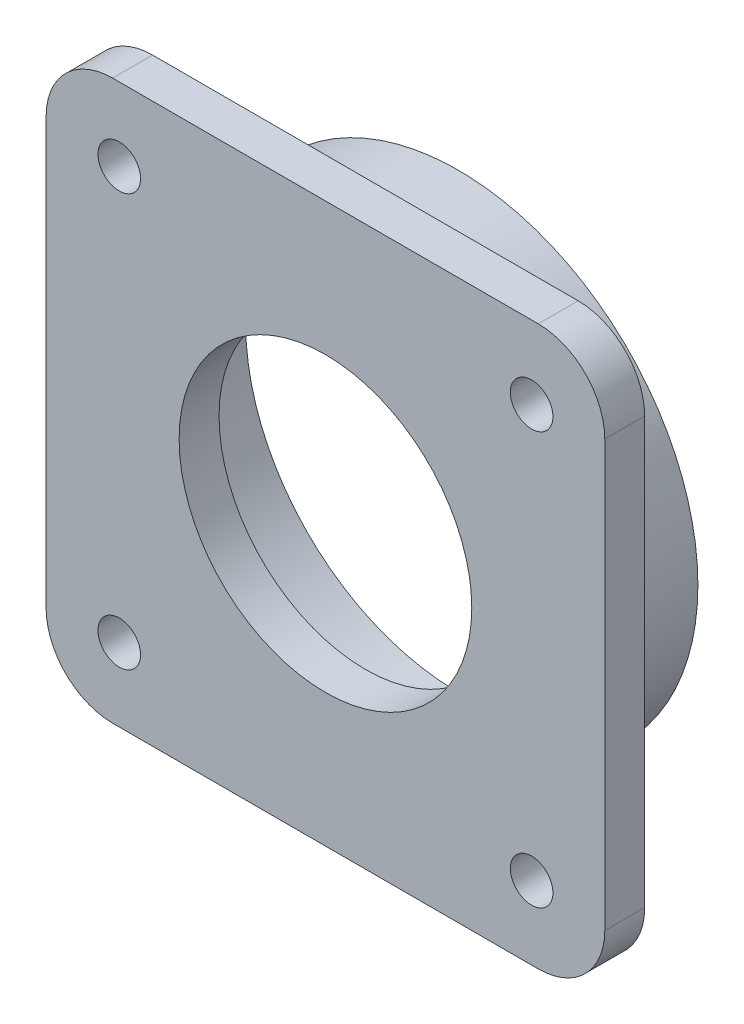
ISO-10303-21;
HEADER;
FILE_DESCRIPTION(('STEP AP214'),'2;1');
FILE_NAME('part.step','',(''),(''),'','','');
FILE_SCHEMA(('AUTOMOTIVE_DESIGN { 1 0 10303 214 1 1 1 1 }'));
ENDSEC;
DATA;
#1=APPLICATION_CONTEXT('core data for automotive mechanical design processes');
#2=APPLICATION_PROTOCOL_DEFINITION('international standard','automotive_design',2000,#1);
#3=PRODUCT_CONTEXT('',#1,'mechanical');
#4=PRODUCT('Part','Part','',(#3));
#5=PRODUCT_RELATED_PRODUCT_CATEGORY('part','',(#4));
#6=PRODUCT_DEFINITION_FORMATION('','',#4);
#7=PRODUCT_DEFINITION_CONTEXT('part definition',#1,'design');
#8=PRODUCT_DEFINITION('design','',#6,#7);
#9=PRODUCT_DEFINITION_SHAPE('','',#8);
#10=(LENGTH_UNIT() NAMED_UNIT(*) SI_UNIT(.MILLI.,.METRE.));
#11=(NAMED_UNIT(*) PLANE_ANGLE_UNIT() SI_UNIT($,.RADIAN.));
#12=(NAMED_UNIT(*) SI_UNIT($,.STERADIAN.) SOLID_ANGLE_UNIT());
#13=UNCERTAINTY_MEASURE_WITH_UNIT(LENGTH_MEASURE(1.E-05),#10,'distance_accuracy_value','');
#14=(GEOMETRIC_REPRESENTATION_CONTEXT(3) GLOBAL_UNCERTAINTY_ASSIGNED_CONTEXT((#13)) GLOBAL_UNIT_ASSIGNED_CONTEXT((#10,
#11,#12)) REPRESENTATION_CONTEXT('',''));
#15=CARTESIAN_POINT('',(0.,0.,0.));
#16=DIRECTION('',(0.,0.,1.));
#17=DIRECTION('',(1.,0.,0.));
#18=AXIS2_PLACEMENT_3D('',#15,#16,#17);
#19=CARTESIAN_POINT('',(0.,0.,0.));
#20=DIRECTION('',(0.,0.,1.));
#21=DIRECTION('',(1.,0.,0.));
#22=AXIS2_PLACEMENT_3D('',#19,#20,#21);
#23=PLANE('',#22);
#24=CARTESIAN_POINT('',(0.,0.,0.));
#25=DIRECTION('',(0.,0.,1.));
#26=DIRECTION('',(1.,0.,0.));
#27=AXIS2_PLACEMENT_3D('',#24,#25,#26);
#28=CIRCLE('',#27,11.);
#29=CARTESIAN_POINT('',(11.,0.,0.));
#30=VERTEX_POINT('',#29);
#31=EDGE_CURVE('E153',#30,#30,#28,.T.);
#32=ORIENTED_EDGE('',*,*,#31,.T.);
#33=EDGE_LOOP('',(#32));
#34=FACE_BOUND('',#33,.T.);
#35=CARTESIAN_POINT('',(0.,0.,0.));
#36=DIRECTION('',(0.,0.,-1.));
#37=DIRECTION('',(-1.,0.,0.));
#38=AXIS2_PLACEMENT_3D('',#35,#36,#37);
#39=CIRCLE('',#38,16.);
#40=CARTESIAN_POINT('',(-16.,0.,0.));
#41=VERTEX_POINT('',#40);
#42=EDGE_CURVE('E333',#41,#41,#39,.T.);
#43=ORIENTED_EDGE('',*,*,#42,.T.);
#44=EDGE_LOOP('',(#43));
#45=FACE_BOUND('',#44,.T.);
#46=ADVANCED_FACE('F47',(#34,#45),#23,.F.);
#47=CARTESIAN_POINT('',(0.,-21.,3.));
#48=DIRECTION('',(0.,1.,0.));
#49=DIRECTION('',(0.,0.,1.));
#50=AXIS2_PLACEMENT_3D('',#47,#48,#49);
#51=PLANE('',#50);
#52=DIRECTION('',(1.,0.,0.));
#53=VECTOR('',#52,1.);
#54=CARTESIAN_POINT('',(0.,-21.,3.));
#55=LINE('',#54,#53);
#56=CARTESIAN_POINT('',(-16.,-21.,3.));
#57=VERTEX_POINT('',#56);
#58=CARTESIAN_POINT('',(16.,-21.,3.));
#59=VERTEX_POINT('',#58);
#60=EDGE_CURVE('E136',#57,#59,#55,.T.);
#61=ORIENTED_EDGE('',*,*,#60,.F.);
#62=DIRECTION('',(0.,0.,-1.));
#63=VECTOR('',#62,1.);
#64=CARTESIAN_POINT('',(-16.,-21.,0.));
#65=LINE('',#64,#63);
#66=CARTESIAN_POINT('',(-16.,-21.,0.));
#67=VERTEX_POINT('',#66);
#68=EDGE_CURVE('E119',#57,#67,#65,.T.);
#69=ORIENTED_EDGE('',*,*,#68,.T.);
#70=DIRECTION('',(1.,0.,0.));
#71=VECTOR('',#70,1.);
#72=CARTESIAN_POINT('',(0.,-21.,0.));
#73=LINE('',#72,#71);
#74=CARTESIAN_POINT('',(16.,-21.,0.));
#75=VERTEX_POINT('',#74);
#76=EDGE_CURVE('E133',#67,#75,#73,.T.);
#77=ORIENTED_EDGE('',*,*,#76,.T.);
#78=DIRECTION('',(0.,0.,-1.));
#79=VECTOR('',#78,1.);
#80=CARTESIAN_POINT('',(16.,-21.,3.));
#81=LINE('',#80,#79);
#82=EDGE_CURVE('E139',#75,#59,#81,.F.);
#83=ORIENTED_EDGE('',*,*,#82,.T.);
#84=EDGE_LOOP('',(#61,#69,#77,#83));
#85=FACE_BOUND('',#84,.T.);
#86=ADVANCED_FACE('F132',(#85),#51,.F.);
#87=CARTESIAN_POINT('',(21.,0.,3.));
#88=DIRECTION('',(-1.,0.,0.));
#89=DIRECTION('',(0.,0.,1.));
#90=AXIS2_PLACEMENT_3D('',#87,#88,#89);
#91=PLANE('',#90);
#92=DIRECTION('',(0.,1.,0.));
#93=VECTOR('',#92,1.);
#94=CARTESIAN_POINT('',(21.,0.,3.));
#95=LINE('',#94,#93);
#96=CARTESIAN_POINT('',(21.,-16.,3.));
#97=VERTEX_POINT('',#96);
#98=CARTESIAN_POINT('',(21.,16.,3.));
#99=VERTEX_POINT('',#98);
#100=EDGE_CURVE('E214',#97,#99,#95,.T.);
#101=ORIENTED_EDGE('',*,*,#100,.F.);
#102=DIRECTION('',(0.,0.,-1.));
#103=VECTOR('',#102,1.);
#104=CARTESIAN_POINT('',(21.,-16.,3.));
#105=LINE('',#104,#103);
#106=CARTESIAN_POINT('',(21.,-16.,0.));
#107=VERTEX_POINT('',#106);
#108=EDGE_CURVE('E193',#97,#107,#105,.T.);
#109=ORIENTED_EDGE('',*,*,#108,.T.);
#110=DIRECTION('',(0.,1.,0.));
#111=VECTOR('',#110,1.);
#112=CARTESIAN_POINT('',(21.,0.,0.));
#113=LINE('',#112,#111);
#114=CARTESIAN_POINT('',(21.,16.,0.));
#115=VERTEX_POINT('',#114);
#116=EDGE_CURVE('E144',#107,#115,#113,.T.);
#117=ORIENTED_EDGE('',*,*,#116,.T.);
#118=DIRECTION('',(0.,0.,-1.));
#119=VECTOR('',#118,1.);
#120=CARTESIAN_POINT('',(21.,16.,3.));
#121=LINE('',#120,#119);
#122=EDGE_CURVE('E190',#115,#99,#121,.F.);
#123=ORIENTED_EDGE('',*,*,#122,.T.);
#124=EDGE_LOOP('',(#101,#109,#117,#123));
#125=FACE_BOUND('',#124,.T.);
#126=ADVANCED_FACE('F259',(#125),#91,.F.);
#127=CARTESIAN_POINT('',(0.,21.,3.));
#128=DIRECTION('',(0.,1.,0.));
#129=DIRECTION('',(0.,0.,1.));
#130=AXIS2_PLACEMENT_3D('',#127,#128,#129);
#131=PLANE('',#130);
#132=DIRECTION('',(1.,0.,0.));
#133=VECTOR('',#132,1.);
#134=CARTESIAN_POINT('',(0.,21.,3.));
#135=LINE('',#134,#133);
#136=CARTESIAN_POINT('',(-16.,21.,3.));
#137=VERTEX_POINT('',#136);
#138=CARTESIAN_POINT('',(16.,21.,3.));
#139=VERTEX_POINT('',#138);
#140=EDGE_CURVE('E202',#137,#139,#135,.T.);
#141=ORIENTED_EDGE('',*,*,#140,.T.);
#142=DIRECTION('',(0.,0.,-1.));
#143=VECTOR('',#142,1.);
#144=CARTESIAN_POINT('',(16.,21.,0.));
#145=LINE('',#144,#143);
#146=CARTESIAN_POINT('',(16.,21.,0.));
#147=VERTEX_POINT('',#146);
#148=EDGE_CURVE('E56',#139,#147,#145,.T.);
#149=ORIENTED_EDGE('',*,*,#148,.T.);
#150=DIRECTION('',(1.,0.,0.));
#151=VECTOR('',#150,1.);
#152=CARTESIAN_POINT('',(0.,21.,0.));
#153=LINE('',#152,#151);
#154=CARTESIAN_POINT('',(-16.,21.,0.));
#155=VERTEX_POINT('',#154);
#156=EDGE_CURVE('E150',#155,#147,#153,.T.);
#157=ORIENTED_EDGE('',*,*,#156,.F.);
#158=DIRECTION('',(0.,0.,-1.));
#159=VECTOR('',#158,1.);
#160=CARTESIAN_POINT('',(-16.,21.,3.));
#161=LINE('',#160,#159);
#162=EDGE_CURVE('E70',#155,#137,#161,.F.);
#163=ORIENTED_EDGE('',*,*,#162,.T.);
#164=EDGE_LOOP('',(#141,#149,#157,#163));
#165=FACE_BOUND('',#164,.T.);
#166=ADVANCED_FACE('F201',(#165),#131,.T.);
#167=CARTESIAN_POINT('',(-15.5,15.5,3.));
#168=DIRECTION('',(0.,0.,-1.));
#169=DIRECTION('',(-1.,0.,0.));
#170=AXIS2_PLACEMENT_3D('',#167,#168,#169);
#171=CYLINDRICAL_SURFACE('',#170,1.6);
#172=CARTESIAN_POINT('',(-15.5,15.5,3.));
#173=DIRECTION('',(0.,0.,1.));
#174=DIRECTION('',(1.,0.,0.));
#175=AXIS2_PLACEMENT_3D('',#172,#173,#174);
#176=CIRCLE('',#175,1.6);
#177=CARTESIAN_POINT('',(-13.9,15.5,3.));
#178=VERTEX_POINT('',#177);
#179=EDGE_CURVE('E310',#178,#178,#176,.T.);
#180=ORIENTED_EDGE('',*,*,#179,.T.);
#181=EDGE_LOOP('',(#180));
#182=FACE_BOUND('',#181,.T.);
#183=CARTESIAN_POINT('',(-15.5,15.5,0.));
#184=DIRECTION('',(0.,0.,1.));
#185=DIRECTION('',(1.,0.,0.));
#186=AXIS2_PLACEMENT_3D('',#183,#184,#185);
#187=CIRCLE('',#186,1.6);
#188=CARTESIAN_POINT('',(-13.9,15.5,0.));
#189=VERTEX_POINT('',#188);
#190=EDGE_CURVE('E145',#189,#189,#187,.T.);
#191=ORIENTED_EDGE('',*,*,#190,.F.);
#192=EDGE_LOOP('',(#191));
#193=FACE_BOUND('',#192,.T.);
#194=ADVANCED_FACE('F239',(#182,#193),#171,.F.);
#195=CARTESIAN_POINT('',(0.,0.,3.));
#196=DIRECTION('',(0.,0.,-1.));
#197=DIRECTION('',(-1.,0.,0.));
#198=AXIS2_PLACEMENT_3D('',#195,#196,#197);
#199=CYLINDRICAL_SURFACE('',#198,11.);
#200=CARTESIAN_POINT('',(0.,0.,3.));
#201=DIRECTION('',(0.,0.,1.));
#202=DIRECTION('',(1.,0.,0.));
#203=AXIS2_PLACEMENT_3D('',#200,#201,#202);
#204=CIRCLE('',#203,11.);
#205=CARTESIAN_POINT('',(11.,0.,3.));
#206=VERTEX_POINT('',#205);
#207=EDGE_CURVE('E316',#206,#206,#204,.T.);
#208=ORIENTED_EDGE('',*,*,#207,.T.);
#209=EDGE_LOOP('',(#208));
#210=FACE_BOUND('',#209,.T.);
#211=ORIENTED_EDGE('',*,*,#31,.F.);
#212=EDGE_LOOP('',(#211));
#213=FACE_BOUND('',#212,.T.);
#214=ADVANCED_FACE('F236',(#210,#213),#199,.F.);
#215=CARTESIAN_POINT('',(-15.5000000000002,-15.4999999999998,3.));
#216=DIRECTION('',(0.,0.,-1.));
#217=DIRECTION('',(-1.,0.,0.));
#218=AXIS2_PLACEMENT_3D('',#215,#216,#217);
#219=CYLINDRICAL_SURFACE('',#218,1.6);
#220=CARTESIAN_POINT('',(-15.5000000000002,-15.4999999999998,3.));
#221=DIRECTION('',(0.,0.,1.));
#222=DIRECTION('',(1.,0.,0.));
#223=AXIS2_PLACEMENT_3D('',#220,#221,#222);
#224=CIRCLE('',#223,1.6);
#225=CARTESIAN_POINT('',(-13.9000000000002,-15.4999999999998,3.));
#226=VERTEX_POINT('',#225);
#227=EDGE_CURVE('E319',#226,#226,#224,.T.);
#228=ORIENTED_EDGE('',*,*,#227,.T.);
#229=EDGE_LOOP('',(#228));
#230=FACE_BOUND('',#229,.T.);
#231=CARTESIAN_POINT('',(-15.5000000000002,-15.4999999999998,0.));
#232=DIRECTION('',(0.,0.,1.));
#233=DIRECTION('',(1.,0.,0.));
#234=AXIS2_PLACEMENT_3D('',#231,#232,#233);
#235=CIRCLE('',#234,1.6);
#236=CARTESIAN_POINT('',(-13.9000000000002,-15.4999999999998,0.));
#237=VERTEX_POINT('',#236);
#238=EDGE_CURVE('E227',#237,#237,#235,.T.);
#239=ORIENTED_EDGE('',*,*,#238,.F.);
#240=EDGE_LOOP('',(#239));
#241=FACE_BOUND('',#240,.T.);
#242=ADVANCED_FACE('F238',(#230,#241),#219,.F.);
#243=CARTESIAN_POINT('',(15.5000000000001,15.4999999999999,3.));
#244=DIRECTION('',(0.,0.,-1.));
#245=DIRECTION('',(-1.,0.,0.));
#246=AXIS2_PLACEMENT_3D('',#243,#244,#245);
#247=CYLINDRICAL_SURFACE('',#246,1.6);
#248=CARTESIAN_POINT('',(15.5000000000001,15.4999999999999,3.));
#249=DIRECTION('',(0.,0.,1.));
#250=DIRECTION('',(1.,0.,0.));
#251=AXIS2_PLACEMENT_3D('',#248,#249,#250);
#252=CIRCLE('',#251,1.6);
#253=CARTESIAN_POINT('',(17.1000000000001,15.4999999999999,3.));
#254=VERTEX_POINT('',#253);
#255=EDGE_CURVE('E323',#254,#254,#252,.T.);
#256=ORIENTED_EDGE('',*,*,#255,.T.);
#257=EDGE_LOOP('',(#256));
#258=FACE_BOUND('',#257,.T.);
#259=CARTESIAN_POINT('',(15.5000000000001,15.4999999999999,0.));
#260=DIRECTION('',(0.,0.,1.));
#261=DIRECTION('',(1.,0.,0.));
#262=AXIS2_PLACEMENT_3D('',#259,#260,#261);
#263=CIRCLE('',#262,1.6);
#264=CARTESIAN_POINT('',(17.1000000000001,15.4999999999999,0.));
#265=VERTEX_POINT('',#264);
#266=EDGE_CURVE('E222',#265,#265,#263,.T.);
#267=ORIENTED_EDGE('',*,*,#266,.F.);
#268=EDGE_LOOP('',(#267));
#269=FACE_BOUND('',#268,.T.);
#270=ADVANCED_FACE('F246',(#258,#269),#247,.F.);
#271=CARTESIAN_POINT('',(15.4999999999999,-15.5000000000001,3.));
#272=DIRECTION('',(0.,0.,-1.));
#273=DIRECTION('',(-1.,0.,0.));
#274=AXIS2_PLACEMENT_3D('',#271,#272,#273);
#275=CYLINDRICAL_SURFACE('',#274,1.6);
#276=CARTESIAN_POINT('',(15.4999999999999,-15.5000000000001,3.));
#277=DIRECTION('',(0.,0.,1.));
#278=DIRECTION('',(1.,0.,0.));
#279=AXIS2_PLACEMENT_3D('',#276,#277,#278);
#280=CIRCLE('',#279,1.6);
#281=CARTESIAN_POINT('',(17.0999999999999,-15.5000000000001,3.));
#282=VERTEX_POINT('',#281);
#283=EDGE_CURVE('E163',#282,#282,#280,.T.);
#284=ORIENTED_EDGE('',*,*,#283,.T.);
#285=EDGE_LOOP('',(#284));
#286=FACE_BOUND('',#285,.T.);
#287=CARTESIAN_POINT('',(15.4999999999999,-15.5000000000001,0.));
#288=DIRECTION('',(0.,0.,1.));
#289=DIRECTION('',(1.,0.,0.));
#290=AXIS2_PLACEMENT_3D('',#287,#288,#289);
#291=CIRCLE('',#290,1.6);
#292=CARTESIAN_POINT('',(17.0999999999999,-15.5000000000001,0.));
#293=VERTEX_POINT('',#292);
#294=EDGE_CURVE('E218',#293,#293,#291,.T.);
#295=ORIENTED_EDGE('',*,*,#294,.F.);
#296=EDGE_LOOP('',(#295));
#297=FACE_BOUND('',#296,.T.);
#298=ADVANCED_FACE('F286',(#286,#297),#275,.F.);
#299=CARTESIAN_POINT('',(-21.,0.,3.));
#300=DIRECTION('',(-1.,0.,0.));
#301=DIRECTION('',(0.,0.,1.));
#302=AXIS2_PLACEMENT_3D('',#299,#300,#301);
#303=PLANE('',#302);
#304=DIRECTION('',(0.,1.,0.));
#305=VECTOR('',#304,1.);
#306=CARTESIAN_POINT('',(-21.,0.,0.));
#307=LINE('',#306,#305);
#308=CARTESIAN_POINT('',(-21.,-16.,0.));
#309=VERTEX_POINT('',#308);
#310=CARTESIAN_POINT('',(-21.,16.,0.));
#311=VERTEX_POINT('',#310);
#312=EDGE_CURVE('E160',#309,#311,#307,.T.);
#313=ORIENTED_EDGE('',*,*,#312,.F.);
#314=DIRECTION('',(0.,0.,-1.));
#315=VECTOR('',#314,1.);
#316=CARTESIAN_POINT('',(-21.,-16.,3.));
#317=LINE('',#316,#315);
#318=CARTESIAN_POINT('',(-21.,-16.,3.));
#319=VERTEX_POINT('',#318);
#320=EDGE_CURVE('E120',#309,#319,#317,.F.);
#321=ORIENTED_EDGE('',*,*,#320,.T.);
#322=DIRECTION('',(0.,1.,0.));
#323=VECTOR('',#322,1.);
#324=CARTESIAN_POINT('',(-21.,0.,3.));
#325=LINE('',#324,#323);
#326=CARTESIAN_POINT('',(-21.,16.,3.));
#327=VERTEX_POINT('',#326);
#328=EDGE_CURVE('E165',#319,#327,#325,.T.);
#329=ORIENTED_EDGE('',*,*,#328,.T.);
#330=DIRECTION('',(0.,0.,-1.));
#331=VECTOR('',#330,1.);
#332=CARTESIAN_POINT('',(-21.,16.,3.));
#333=LINE('',#332,#331);
#334=EDGE_CURVE('E126',#327,#311,#333,.T.);
#335=ORIENTED_EDGE('',*,*,#334,.T.);
#336=EDGE_LOOP('',(#313,#321,#329,#335));
#337=FACE_BOUND('',#336,.T.);
#338=ADVANCED_FACE('F209',(#337),#303,.T.);
#339=CARTESIAN_POINT('',(0.,0.,3.));
#340=DIRECTION('',(0.,0.,1.));
#341=DIRECTION('',(1.,0.,0.));
#342=AXIS2_PLACEMENT_3D('',#339,#340,#341);
#343=PLANE('',#342);
#344=ORIENTED_EDGE('',*,*,#283,.F.);
#345=EDGE_LOOP('',(#344));
#346=FACE_BOUND('',#345,.T.);
#347=ORIENTED_EDGE('',*,*,#255,.F.);
#348=EDGE_LOOP('',(#347));
#349=FACE_BOUND('',#348,.T.);
#350=ORIENTED_EDGE('',*,*,#227,.F.);
#351=EDGE_LOOP('',(#350));
#352=FACE_BOUND('',#351,.T.);
#353=ORIENTED_EDGE('',*,*,#207,.F.);
#354=EDGE_LOOP('',(#353));
#355=FACE_BOUND('',#354,.T.);
#356=ORIENTED_EDGE('',*,*,#179,.F.);
#357=EDGE_LOOP('',(#356));
#358=FACE_BOUND('',#357,.T.);
#359=ORIENTED_EDGE('',*,*,#328,.F.);
#360=CARTESIAN_POINT('',(-16.,-16.,3.));
#361=DIRECTION('',(0.,0.,1.));
#362=DIRECTION('',(1.,0.,0.));
#363=AXIS2_PLACEMENT_3D('',#360,#361,#362);
#364=CIRCLE('',#363,5.);
#365=EDGE_CURVE('E187',#319,#57,#364,.T.);
#366=ORIENTED_EDGE('',*,*,#365,.T.);
#367=ORIENTED_EDGE('',*,*,#60,.T.);
#368=CARTESIAN_POINT('',(16.,-16.,3.));
#369=DIRECTION('',(0.,0.,1.));
#370=DIRECTION('',(1.,0.,0.));
#371=AXIS2_PLACEMENT_3D('',#368,#369,#370);
#372=CIRCLE('',#371,5.);
#373=EDGE_CURVE('E184',#59,#97,#372,.T.);
#374=ORIENTED_EDGE('',*,*,#373,.T.);
#375=ORIENTED_EDGE('',*,*,#100,.T.);
#376=CARTESIAN_POINT('',(16.,16.,3.));
#377=DIRECTION('',(0.,0.,1.));
#378=DIRECTION('',(1.,0.,0.));
#379=AXIS2_PLACEMENT_3D('',#376,#377,#378);
#380=CIRCLE('',#379,5.);
#381=EDGE_CURVE('E63',#99,#139,#380,.T.);
#382=ORIENTED_EDGE('',*,*,#381,.T.);
#383=ORIENTED_EDGE('',*,*,#140,.F.);
#384=CARTESIAN_POINT('',(-16.,16.,3.));
#385=DIRECTION('',(0.,0.,1.));
#386=DIRECTION('',(1.,0.,0.));
#387=AXIS2_PLACEMENT_3D('',#384,#385,#386);
#388=CIRCLE('',#387,5.);
#389=EDGE_CURVE('E179',#137,#327,#388,.T.);
#390=ORIENTED_EDGE('',*,*,#389,.T.);
#391=EDGE_LOOP('',(#359,#366,#367,#374,#375,#382,#383,#390));
#392=FACE_BOUND('',#391,.T.);
#393=ADVANCED_FACE('F263',(#346,#349,#352,#355,#358,#392),#343,.T.);
#394=CARTESIAN_POINT('',(0.,0.,0.));
#395=DIRECTION('',(0.,0.,1.));
#396=DIRECTION('',(1.,0.,0.));
#397=AXIS2_PLACEMENT_3D('',#394,#395,#396);
#398=CIRCLE('',#397,18.);
#399=CARTESIAN_POINT('',(18.,0.,0.));
#400=VERTEX_POINT('',#399);
#401=EDGE_CURVE('E11',#400,#400,#398,.F.);
#402=ORIENTED_EDGE('',*,*,#401,.F.);
#403=EDGE_LOOP('',(#402));
#404=FACE_BOUND('',#403,.T.);
#405=ORIENTED_EDGE('',*,*,#294,.T.);
#406=EDGE_LOOP('',(#405));
#407=FACE_BOUND('',#406,.T.);
#408=ORIENTED_EDGE('',*,*,#266,.T.);
#409=EDGE_LOOP('',(#408));
#410=FACE_BOUND('',#409,.T.);
#411=ORIENTED_EDGE('',*,*,#238,.T.);
#412=EDGE_LOOP('',(#411));
#413=FACE_BOUND('',#412,.T.);
#414=ORIENTED_EDGE('',*,*,#190,.T.);
#415=EDGE_LOOP('',(#414));
#416=FACE_BOUND('',#415,.T.);
#417=ORIENTED_EDGE('',*,*,#76,.F.);
#418=CARTESIAN_POINT('',(-16.,-16.,0.));
#419=DIRECTION('',(0.,0.,1.));
#420=DIRECTION('',(1.,0.,0.));
#421=AXIS2_PLACEMENT_3D('',#418,#419,#420);
#422=CIRCLE('',#421,5.);
#423=EDGE_CURVE('E115',#67,#309,#422,.F.);
#424=ORIENTED_EDGE('',*,*,#423,.T.);
#425=ORIENTED_EDGE('',*,*,#312,.T.);
#426=CARTESIAN_POINT('',(-16.,16.,0.));
#427=DIRECTION('',(0.,0.,1.));
#428=DIRECTION('',(1.,0.,0.));
#429=AXIS2_PLACEMENT_3D('',#426,#427,#428);
#430=CIRCLE('',#429,5.);
#431=EDGE_CURVE('E138',#311,#155,#430,.F.);
#432=ORIENTED_EDGE('',*,*,#431,.T.);
#433=ORIENTED_EDGE('',*,*,#156,.T.);
#434=CARTESIAN_POINT('',(16.,16.,0.));
#435=DIRECTION('',(0.,0.,1.));
#436=DIRECTION('',(1.,0.,0.));
#437=AXIS2_PLACEMENT_3D('',#434,#435,#436);
#438=CIRCLE('',#437,5.);
#439=EDGE_CURVE('E169',#147,#115,#438,.F.);
#440=ORIENTED_EDGE('',*,*,#439,.T.);
#441=ORIENTED_EDGE('',*,*,#116,.F.);
#442=CARTESIAN_POINT('',(16.,-16.,0.));
#443=DIRECTION('',(0.,0.,1.));
#444=DIRECTION('',(1.,0.,0.));
#445=AXIS2_PLACEMENT_3D('',#442,#443,#444);
#446=CIRCLE('',#445,5.);
#447=EDGE_CURVE('E127',#107,#75,#446,.F.);
#448=ORIENTED_EDGE('',*,*,#447,.T.);
#449=EDGE_LOOP('',(#417,#424,#425,#432,#433,#440,#441,#448));
#450=FACE_BOUND('',#449,.T.);
#451=ADVANCED_FACE('F141',(#404,#407,#410,#413,#416,#450),#23,.F.);
#452=CARTESIAN_POINT('',(-16.,-16.,3.));
#453=DIRECTION('',(0.,0.,1.));
#454=DIRECTION('',(1.,0.,0.));
#455=AXIS2_PLACEMENT_3D('',#452,#453,#454);
#456=CYLINDRICAL_SURFACE('',#455,5.);
#457=ORIENTED_EDGE('',*,*,#365,.F.);
#458=ORIENTED_EDGE('',*,*,#320,.F.);
#459=ORIENTED_EDGE('',*,*,#423,.F.);
#460=ORIENTED_EDGE('',*,*,#68,.F.);
#461=EDGE_LOOP('',(#457,#458,#459,#460));
#462=FACE_BOUND('',#461,.T.);
#463=ADVANCED_FACE('F118',(#462),#456,.T.);
#464=CARTESIAN_POINT('',(16.,-16.,3.));
#465=DIRECTION('',(0.,0.,-1.));
#466=DIRECTION('',(-1.,0.,0.));
#467=AXIS2_PLACEMENT_3D('',#464,#465,#466);
#468=CYLINDRICAL_SURFACE('',#467,5.);
#469=ORIENTED_EDGE('',*,*,#373,.F.);
#470=ORIENTED_EDGE('',*,*,#82,.F.);
#471=ORIENTED_EDGE('',*,*,#447,.F.);
#472=ORIENTED_EDGE('',*,*,#108,.F.);
#473=EDGE_LOOP('',(#469,#470,#471,#472));
#474=FACE_BOUND('',#473,.T.);
#475=ADVANCED_FACE('F269',(#474),#468,.T.);
#476=CARTESIAN_POINT('',(16.,16.,3.));
#477=DIRECTION('',(0.,0.,1.));
#478=DIRECTION('',(1.,0.,0.));
#479=AXIS2_PLACEMENT_3D('',#476,#477,#478);
#480=CYLINDRICAL_SURFACE('',#479,5.);
#481=ORIENTED_EDGE('',*,*,#381,.F.);
#482=ORIENTED_EDGE('',*,*,#122,.F.);
#483=ORIENTED_EDGE('',*,*,#439,.F.);
#484=ORIENTED_EDGE('',*,*,#148,.F.);
#485=EDGE_LOOP('',(#481,#482,#483,#484));
#486=FACE_BOUND('',#485,.T.);
#487=ADVANCED_FACE('F297',(#486),#480,.T.);
#488=CARTESIAN_POINT('',(-16.,16.,3.));
#489=DIRECTION('',(0.,0.,-1.));
#490=DIRECTION('',(-1.,0.,0.));
#491=AXIS2_PLACEMENT_3D('',#488,#489,#490);
#492=CYLINDRICAL_SURFACE('',#491,5.);
#493=ORIENTED_EDGE('',*,*,#389,.F.);
#494=ORIENTED_EDGE('',*,*,#162,.F.);
#495=ORIENTED_EDGE('',*,*,#431,.F.);
#496=ORIENTED_EDGE('',*,*,#334,.F.);
#497=EDGE_LOOP('',(#493,#494,#495,#496));
#498=FACE_BOUND('',#497,.T.);
#499=ADVANCED_FACE('F49',(#498),#492,.T.);
#500=CARTESIAN_POINT('',(0.,0.,-7.));
#501=DIRECTION('',(0.,0.,-1.));
#502=DIRECTION('',(-1.,0.,0.));
#503=AXIS2_PLACEMENT_3D('',#500,#501,#502);
#504=PLANE('',#503);
#505=CARTESIAN_POINT('',(0.,0.,-7.));
#506=DIRECTION('',(0.,0.,-1.));
#507=DIRECTION('',(-1.,0.,0.));
#508=AXIS2_PLACEMENT_3D('',#505,#506,#507);
#509=CIRCLE('',#508,18.);
#510=CARTESIAN_POINT('',(-18.,0.,-7.));
#511=VERTEX_POINT('',#510);
#512=EDGE_CURVE('E223',#511,#511,#509,.T.);
#513=ORIENTED_EDGE('',*,*,#512,.T.);
#514=EDGE_LOOP('',(#513));
#515=FACE_BOUND('',#514,.T.);
#516=CARTESIAN_POINT('',(0.,0.,-7.));
#517=DIRECTION('',(0.,0.,-1.));
#518=DIRECTION('',(-1.,0.,0.));
#519=AXIS2_PLACEMENT_3D('',#516,#517,#518);
#520=CIRCLE('',#519,16.);
#521=CARTESIAN_POINT('',(-16.,0.,-7.));
#522=VERTEX_POINT('',#521);
#523=EDGE_CURVE('E332',#522,#522,#520,.T.);
#524=ORIENTED_EDGE('',*,*,#523,.F.);
#525=EDGE_LOOP('',(#524));
#526=FACE_BOUND('',#525,.T.);
#527=ADVANCED_FACE('F302',(#515,#526),#504,.T.);
#528=CARTESIAN_POINT('',(0.,0.,-7.));
#529=DIRECTION('',(0.,0.,1.));
#530=DIRECTION('',(1.,0.,0.));
#531=AXIS2_PLACEMENT_3D('',#528,#529,#530);
#532=CYLINDRICAL_SURFACE('',#531,18.);
#533=ORIENTED_EDGE('',*,*,#512,.F.);
#534=EDGE_LOOP('',(#533));
#535=FACE_BOUND('',#534,.T.);
#536=ORIENTED_EDGE('',*,*,#401,.T.);
#537=EDGE_LOOP('',(#536));
#538=FACE_BOUND('',#537,.T.);
#539=ADVANCED_FACE('F344',(#535,#538),#532,.T.);
#540=CARTESIAN_POINT('',(0.,0.,-7.));
#541=DIRECTION('',(0.,0.,1.));
#542=DIRECTION('',(1.,0.,0.));
#543=AXIS2_PLACEMENT_3D('',#540,#541,#542);
#544=CYLINDRICAL_SURFACE('',#543,16.);
#545=ORIENTED_EDGE('',*,*,#523,.T.);
#546=EDGE_LOOP('',(#545));
#547=FACE_BOUND('',#546,.T.);
#548=ORIENTED_EDGE('',*,*,#42,.F.);
#549=EDGE_LOOP('',(#548));
#550=FACE_BOUND('',#549,.T.);
#551=ADVANCED_FACE('F341',(#547,#550),#544,.F.);
#552=CLOSED_SHELL('',(#46,#86,#126,#166,#194,#214,#242,#270,#298,#338,#393,#451,#463,#475,#487,
#499,#527,#539,#551));
#553=MANIFOLD_SOLID_BREP('B2',#552);
#554=ADVANCED_BREP_SHAPE_REPRESENTATION('',(#18,#553),#14);
#555=SHAPE_DEFINITION_REPRESENTATION(#9,#554);
ENDSEC;
END-ISO-10303-21;
